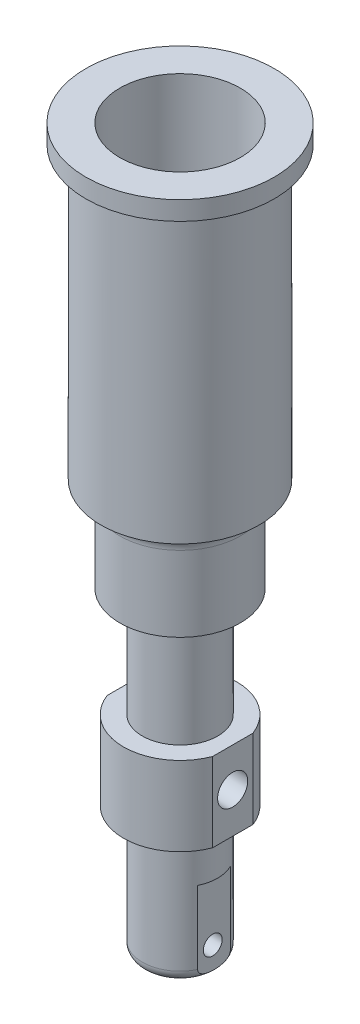
ISO-10303-21;
HEADER;
FILE_DESCRIPTION(('STEP AP214'),'2;1');
FILE_NAME('part.step','',(''),(''),'','','');
FILE_SCHEMA(('AUTOMOTIVE_DESIGN { 1 0 10303 214 1 1 1 1 }'));
ENDSEC;
DATA;
#1=APPLICATION_CONTEXT('core data for automotive mechanical design processes');
#2=APPLICATION_PROTOCOL_DEFINITION('international standard','automotive_design',2000,#1);
#3=PRODUCT_CONTEXT('',#1,'mechanical');
#4=PRODUCT('Part','Part','',(#3));
#5=PRODUCT_RELATED_PRODUCT_CATEGORY('part','',(#4));
#6=PRODUCT_DEFINITION_FORMATION('','',#4);
#7=PRODUCT_DEFINITION_CONTEXT('part definition',#1,'design');
#8=PRODUCT_DEFINITION('design','',#6,#7);
#9=PRODUCT_DEFINITION_SHAPE('','',#8);
#10=(LENGTH_UNIT() NAMED_UNIT(*) SI_UNIT(.MILLI.,.METRE.));
#11=(NAMED_UNIT(*) PLANE_ANGLE_UNIT() SI_UNIT($,.RADIAN.));
#12=(NAMED_UNIT(*) SI_UNIT($,.STERADIAN.) SOLID_ANGLE_UNIT());
#13=UNCERTAINTY_MEASURE_WITH_UNIT(LENGTH_MEASURE(1.E-05),#10,'distance_accuracy_value','');
#14=(GEOMETRIC_REPRESENTATION_CONTEXT(3) GLOBAL_UNCERTAINTY_ASSIGNED_CONTEXT((#13)) GLOBAL_UNIT_ASSIGNED_CONTEXT((#10,
#11,#12)) REPRESENTATION_CONTEXT('',''));
#15=CARTESIAN_POINT('',(0.,0.,0.));
#16=DIRECTION('',(0.,0.,1.));
#17=DIRECTION('',(1.,0.,0.));
#18=AXIS2_PLACEMENT_3D('',#15,#16,#17);
#19=CARTESIAN_POINT('',(0.,-82.,0.));
#20=DIRECTION('',(0.,1.,0.));
#21=DIRECTION('',(0.,0.,1.));
#22=AXIS2_PLACEMENT_3D('',#19,#20,#21);
#23=CYLINDRICAL_SURFACE('',#22,15.);
#24=CARTESIAN_POINT('',(0.,-82.,0.));
#25=DIRECTION('',(0.,-1.,0.));
#26=DIRECTION('',(0.,0.,-1.));
#27=AXIS2_PLACEMENT_3D('',#24,#25,#26);
#28=CIRCLE('',#27,15.);
#29=CARTESIAN_POINT('',(14.0111880375358,-82.,5.35598821664264));
#30=VERTEX_POINT('',#29);
#31=CARTESIAN_POINT('',(-14.0111880375358,-82.,5.35598821664264));
#32=VERTEX_POINT('',#31);
#33=EDGE_CURVE('E56',#30,#32,#28,.T.);
#34=ORIENTED_EDGE('',*,*,#33,.F.);
#35=DIRECTION('',(0.,1.,0.));
#36=VECTOR('',#35,1.);
#37=CARTESIAN_POINT('',(14.0111880375358,-82.,5.35598821664264));
#38=LINE('',#37,#36);
#39=CARTESIAN_POINT('',(14.0111880375358,-61.,5.35598821664264));
#40=VERTEX_POINT('',#39);
#41=EDGE_CURVE('E266',#30,#40,#38,.T.);
#42=ORIENTED_EDGE('',*,*,#41,.T.);
#43=CARTESIAN_POINT('',(0.,-61.,0.));
#44=DIRECTION('',(0.,-1.,0.));
#45=DIRECTION('',(0.,0.,-1.));
#46=AXIS2_PLACEMENT_3D('',#43,#44,#45);
#47=CIRCLE('',#46,15.);
#48=CARTESIAN_POINT('',(-14.0111880375358,-61.,5.35598821664264));
#49=VERTEX_POINT('',#48);
#50=EDGE_CURVE('E114',#40,#49,#47,.T.);
#51=ORIENTED_EDGE('',*,*,#50,.T.);
#52=DIRECTION('',(0.,1.,0.));
#53=VECTOR('',#52,1.);
#54=CARTESIAN_POINT('',(-14.0111880375358,-82.,5.35598821664264));
#55=LINE('',#54,#53);
#56=EDGE_CURVE('E265',#49,#32,#55,.F.);
#57=ORIENTED_EDGE('',*,*,#56,.T.);
#58=EDGE_LOOP('',(#34,#42,#51,#57));
#59=FACE_BOUND('',#58,.T.);
#60=ADVANCED_FACE('F32',(#59),#23,.T.);
#61=CARTESIAN_POINT('',(0.,-116.,0.));
#62=DIRECTION('',(0.,1.,0.));
#63=DIRECTION('',(0.,0.,1.));
#64=AXIS2_PLACEMENT_3D('',#61,#62,#63);
#65=CYLINDRICAL_SURFACE('',#64,10.);
#66=CARTESIAN_POINT('',(0.,-32.,0.));
#67=DIRECTION('',(0.,-1.,0.));
#68=DIRECTION('',(0.,0.,-1.));
#69=AXIS2_PLACEMENT_3D('',#66,#67,#68);
#70=CIRCLE('',#69,10.);
#71=CARTESIAN_POINT('',(0.,-32.,-10.));
#72=VERTEX_POINT('',#71);
#73=EDGE_CURVE('E137',#72,#72,#70,.T.);
#74=ORIENTED_EDGE('',*,*,#73,.T.);
#75=EDGE_LOOP('',(#74));
#76=FACE_BOUND('',#75,.T.);
#77=CARTESIAN_POINT('',(0.,-61.,0.));
#78=DIRECTION('',(0.,-1.,0.));
#79=DIRECTION('',(0.,0.,-1.));
#80=AXIS2_PLACEMENT_3D('',#77,#78,#79);
#81=CIRCLE('',#80,10.);
#82=CARTESIAN_POINT('',(0.,-61.,-10.));
#83=VERTEX_POINT('',#82);
#84=EDGE_CURVE('E11',#83,#83,#81,.T.);
#85=ORIENTED_EDGE('',*,*,#84,.F.);
#86=EDGE_LOOP('',(#85));
#87=FACE_BOUND('',#86,.T.);
#88=ADVANCED_FACE('F205',(#76,#87),#65,.T.);
#89=CARTESIAN_POINT('',(0.,70.,0.));
#90=DIRECTION('',(0.,-1.,0.));
#91=DIRECTION('',(0.,0.,-1.));
#92=AXIS2_PLACEMENT_3D('',#89,#90,#91);
#93=CYLINDRICAL_SURFACE('',#92,21.);
#94=CARTESIAN_POINT('',(0.,70.,0.));
#95=DIRECTION('',(0.,1.,0.));
#96=DIRECTION('',(0.,0.,1.));
#97=AXIS2_PLACEMENT_3D('',#94,#95,#96);
#98=CIRCLE('',#97,21.);
#99=CARTESIAN_POINT('',(0.,70.,21.));
#100=VERTEX_POINT('',#99);
#101=EDGE_CURVE('E166',#100,#100,#98,.T.);
#102=ORIENTED_EDGE('',*,*,#101,.F.);
#103=EDGE_LOOP('',(#102));
#104=FACE_BOUND('',#103,.T.);
#105=CARTESIAN_POINT('',(0.,-7.,0.));
#106=DIRECTION('',(0.,-1.,0.));
#107=DIRECTION('',(0.,0.,-1.));
#108=AXIS2_PLACEMENT_3D('',#105,#106,#107);
#109=CIRCLE('',#108,21.);
#110=CARTESIAN_POINT('',(0.,-7.,-21.));
#111=VERTEX_POINT('',#110);
#112=EDGE_CURVE('E160',#111,#111,#109,.T.);
#113=ORIENTED_EDGE('',*,*,#112,.F.);
#114=EDGE_LOOP('',(#113));
#115=FACE_BOUND('',#114,.T.);
#116=ADVANCED_FACE('F215',(#104,#115),#93,.T.);
#117=CARTESIAN_POINT('',(0.,-32.,0.));
#118=DIRECTION('',(0.,-1.,0.));
#119=DIRECTION('',(0.,0.,-1.));
#120=AXIS2_PLACEMENT_3D('',#117,#118,#119);
#121=PLANE('',#120);
#122=CARTESIAN_POINT('',(0.,-32.,0.));
#123=DIRECTION('',(0.,-1.,0.));
#124=DIRECTION('',(0.,0.,-1.));
#125=AXIS2_PLACEMENT_3D('',#122,#123,#124);
#126=CIRCLE('',#125,16.);
#127=CARTESIAN_POINT('',(0.,-32.,-16.));
#128=VERTEX_POINT('',#127);
#129=EDGE_CURVE('E132',#128,#128,#126,.T.);
#130=ORIENTED_EDGE('',*,*,#129,.T.);
#131=EDGE_LOOP('',(#130));
#132=FACE_BOUND('',#131,.T.);
#133=ORIENTED_EDGE('',*,*,#73,.F.);
#134=EDGE_LOOP('',(#133));
#135=FACE_BOUND('',#134,.T.);
#136=ADVANCED_FACE('F217',(#132,#135),#121,.T.);
#137=CARTESIAN_POINT('',(0.,-32.,0.));
#138=DIRECTION('',(0.,1.,0.));
#139=DIRECTION('',(0.,0.,1.));
#140=AXIS2_PLACEMENT_3D('',#137,#138,#139);
#141=CYLINDRICAL_SURFACE('',#140,16.);
#142=CARTESIAN_POINT('',(0.,-12.,0.));
#143=DIRECTION('',(0.,-1.,0.));
#144=DIRECTION('',(0.,0.,-1.));
#145=AXIS2_PLACEMENT_3D('',#142,#143,#144);
#146=CIRCLE('',#145,16.);
#147=CARTESIAN_POINT('',(0.,-12.,-16.));
#148=VERTEX_POINT('',#147);
#149=EDGE_CURVE('E41',#148,#148,#146,.T.);
#150=ORIENTED_EDGE('',*,*,#149,.T.);
#151=EDGE_LOOP('',(#150));
#152=FACE_BOUND('',#151,.T.);
#153=ORIENTED_EDGE('',*,*,#129,.F.);
#154=EDGE_LOOP('',(#153));
#155=FACE_BOUND('',#154,.T.);
#156=ADVANCED_FACE('F223',(#152,#155),#141,.T.);
#157=CARTESIAN_POINT('',(0.,-12.,0.));
#158=DIRECTION('',(0.,-1.,0.));
#159=DIRECTION('',(0.,0.,-1.));
#160=AXIS2_PLACEMENT_3D('',#157,#158,#159);
#161=TOROIDAL_SURFACE('',#160,21.,5.);
#162=ORIENTED_EDGE('',*,*,#112,.T.);
#163=EDGE_LOOP('',(#162));
#164=FACE_BOUND('',#163,.T.);
#165=ORIENTED_EDGE('',*,*,#149,.F.);
#166=EDGE_LOOP('',(#165));
#167=FACE_BOUND('',#166,.T.);
#168=ADVANCED_FACE('F34',(#164,#167),#161,.F.);
#169=CARTESIAN_POINT('',(0.,70.,0.));
#170=DIRECTION('',(0.,1.,0.));
#171=DIRECTION('',(0.,0.,1.));
#172=AXIS2_PLACEMENT_3D('',#169,#170,#171);
#173=PLANE('',#172);
#174=CARTESIAN_POINT('',(0.,70.,0.));
#175=DIRECTION('',(0.,1.,0.));
#176=DIRECTION('',(0.,0.,1.));
#177=AXIS2_PLACEMENT_3D('',#174,#175,#176);
#178=CIRCLE('',#177,25.);
#179=CARTESIAN_POINT('',(0.,70.,25.));
#180=VERTEX_POINT('',#179);
#181=EDGE_CURVE('E127',#180,#180,#178,.T.);
#182=ORIENTED_EDGE('',*,*,#181,.F.);
#183=EDGE_LOOP('',(#182));
#184=FACE_BOUND('',#183,.T.);
#185=ORIENTED_EDGE('',*,*,#101,.T.);
#186=EDGE_LOOP('',(#185));
#187=FACE_BOUND('',#186,.T.);
#188=ADVANCED_FACE('F357',(#184,#187),#173,.F.);
#189=CARTESIAN_POINT('',(0.,75.,0.));
#190=DIRECTION('',(0.,1.,0.));
#191=DIRECTION('',(0.,0.,1.));
#192=AXIS2_PLACEMENT_3D('',#189,#190,#191);
#193=PLANE('',#192);
#194=CARTESIAN_POINT('',(0.,75.,0.));
#195=DIRECTION('',(0.,1.,0.));
#196=DIRECTION('',(0.,0.,1.));
#197=AXIS2_PLACEMENT_3D('',#194,#195,#196);
#198=CIRCLE('',#197,25.);
#199=CARTESIAN_POINT('',(0.,75.,25.));
#200=VERTEX_POINT('',#199);
#201=EDGE_CURVE('E129',#200,#200,#198,.T.);
#202=ORIENTED_EDGE('',*,*,#201,.T.);
#203=EDGE_LOOP('',(#202));
#204=FACE_BOUND('',#203,.T.);
#205=CARTESIAN_POINT('',(0.,75.,0.));
#206=DIRECTION('',(0.,1.,0.));
#207=DIRECTION('',(0.,0.,1.));
#208=AXIS2_PLACEMENT_3D('',#205,#206,#207);
#209=CIRCLE('',#208,16.);
#210=CARTESIAN_POINT('',(0.,75.,16.));
#211=VERTEX_POINT('',#210);
#212=EDGE_CURVE('E124',#211,#211,#209,.T.);
#213=ORIENTED_EDGE('',*,*,#212,.F.);
#214=EDGE_LOOP('',(#213));
#215=FACE_BOUND('',#214,.T.);
#216=ADVANCED_FACE('F366',(#204,#215),#193,.T.);
#217=CARTESIAN_POINT('',(0.,75.,0.));
#218=DIRECTION('',(0.,-1.,0.));
#219=DIRECTION('',(0.,0.,-1.));
#220=AXIS2_PLACEMENT_3D('',#217,#218,#219);
#221=CYLINDRICAL_SURFACE('',#220,25.);
#222=ORIENTED_EDGE('',*,*,#201,.F.);
#223=EDGE_LOOP('',(#222));
#224=FACE_BOUND('',#223,.T.);
#225=ORIENTED_EDGE('',*,*,#181,.T.);
#226=EDGE_LOOP('',(#225));
#227=FACE_BOUND('',#226,.T.);
#228=ADVANCED_FACE('F210',(#224,#227),#221,.T.);
#229=CARTESIAN_POINT('',(0.,0.,0.));
#230=DIRECTION('',(0.,-1.,0.));
#231=DIRECTION('',(0.,0.,-1.));
#232=AXIS2_PLACEMENT_3D('',#229,#230,#231);
#233=PLANE('',#232);
#234=CARTESIAN_POINT('',(0.,0.,0.));
#235=DIRECTION('',(0.,1.,0.));
#236=DIRECTION('',(0.,0.,1.));
#237=AXIS2_PLACEMENT_3D('',#234,#235,#236);
#238=CIRCLE('',#237,16.);
#239=CARTESIAN_POINT('',(0.,0.,16.));
#240=VERTEX_POINT('',#239);
#241=EDGE_CURVE('E163',#240,#240,#238,.T.);
#242=ORIENTED_EDGE('',*,*,#241,.T.);
#243=EDGE_LOOP('',(#242));
#244=FACE_BOUND('',#243,.T.);
#245=ADVANCED_FACE('F206',(#244),#233,.F.);
#246=CARTESIAN_POINT('',(0.,70.,0.));
#247=DIRECTION('',(0.,-1.,0.));
#248=DIRECTION('',(0.,0.,-1.));
#249=AXIS2_PLACEMENT_3D('',#246,#247,#248);
#250=CYLINDRICAL_SURFACE('',#249,16.);
#251=ORIENTED_EDGE('',*,*,#241,.F.);
#252=EDGE_LOOP('',(#251));
#253=FACE_BOUND('',#252,.T.);
#254=ORIENTED_EDGE('',*,*,#212,.T.);
#255=EDGE_LOOP('',(#254));
#256=FACE_BOUND('',#255,.T.);
#257=ADVANCED_FACE('F209',(#253,#256),#250,.F.);
#258=CARTESIAN_POINT('',(0.,-82.,0.));
#259=DIRECTION('',(0.,-1.,0.));
#260=DIRECTION('',(0.,0.,-1.));
#261=AXIS2_PLACEMENT_3D('',#258,#259,#260);
#262=PLANE('',#261);
#263=DIRECTION('',(0.,0.,-1.));
#264=VECTOR('',#263,1.);
#265=CARTESIAN_POINT('',(14.0111880375358,-82.,0.));
#266=LINE('',#265,#264);
#267=CARTESIAN_POINT('',(14.0111880375358,-82.,-5.35598821664264));
#268=VERTEX_POINT('',#267);
#269=EDGE_CURVE('E49',#30,#268,#266,.T.);
#270=ORIENTED_EDGE('',*,*,#269,.F.);
#271=ORIENTED_EDGE('',*,*,#33,.T.);
#272=DIRECTION('',(0.,0.,1.));
#273=VECTOR('',#272,1.);
#274=CARTESIAN_POINT('',(-14.0111880375358,-82.,0.));
#275=LINE('',#274,#273);
#276=CARTESIAN_POINT('',(-14.0111880375358,-82.,-5.35598821664264));
#277=VERTEX_POINT('',#276);
#278=EDGE_CURVE('E491',#277,#32,#275,.T.);
#279=ORIENTED_EDGE('',*,*,#278,.F.);
#280=EDGE_CURVE('E120',#277,#268,#28,.T.);
#281=ORIENTED_EDGE('',*,*,#280,.T.);
#282=EDGE_LOOP('',(#270,#271,#279,#281));
#283=FACE_BOUND('',#282,.T.);
#284=CARTESIAN_POINT('',(0.,-82.,0.));
#285=DIRECTION('',(0.,-1.,0.));
#286=DIRECTION('',(0.,0.,-1.));
#287=AXIS2_PLACEMENT_3D('',#284,#285,#286);
#288=CIRCLE('',#287,10.);
#289=CARTESIAN_POINT('',(0.,-82.,-10.));
#290=VERTEX_POINT('',#289);
#291=EDGE_CURVE('E128',#290,#290,#288,.T.);
#292=ORIENTED_EDGE('',*,*,#291,.F.);
#293=EDGE_LOOP('',(#292));
#294=FACE_BOUND('',#293,.T.);
#295=ADVANCED_FACE('F213',(#283,#294),#262,.T.);
#296=CARTESIAN_POINT('',(0.,-61.,0.));
#297=DIRECTION('',(0.,-1.,0.));
#298=DIRECTION('',(0.,0.,-1.));
#299=AXIS2_PLACEMENT_3D('',#296,#297,#298);
#300=PLANE('',#299);
#301=ORIENTED_EDGE('',*,*,#50,.F.);
#302=DIRECTION('',(0.,0.,-1.));
#303=VECTOR('',#302,1.);
#304=CARTESIAN_POINT('',(14.0111880375358,-61.,0.));
#305=LINE('',#304,#303);
#306=CARTESIAN_POINT('',(14.0111880375358,-61.,-5.35598821664264));
#307=VERTEX_POINT('',#306);
#308=EDGE_CURVE('E100',#40,#307,#305,.T.);
#309=ORIENTED_EDGE('',*,*,#308,.T.);
#310=CARTESIAN_POINT('',(-14.0111880375358,-61.,-5.35598821664264));
#311=VERTEX_POINT('',#310);
#312=EDGE_CURVE('E113',#311,#307,#47,.T.);
#313=ORIENTED_EDGE('',*,*,#312,.F.);
#314=DIRECTION('',(0.,0.,1.));
#315=VECTOR('',#314,1.);
#316=CARTESIAN_POINT('',(-14.0111880375358,-61.,0.));
#317=LINE('',#316,#315);
#318=EDGE_CURVE('E268',#311,#49,#317,.T.);
#319=ORIENTED_EDGE('',*,*,#318,.T.);
#320=EDGE_LOOP('',(#301,#309,#313,#319));
#321=FACE_BOUND('',#320,.T.);
#322=ORIENTED_EDGE('',*,*,#84,.T.);
#323=EDGE_LOOP('',(#322));
#324=FACE_BOUND('',#323,.T.);
#325=ADVANCED_FACE('F110',(#321,#324),#300,.F.);
#326=ORIENTED_EDGE('',*,*,#312,.T.);
#327=DIRECTION('',(0.,1.,0.));
#328=VECTOR('',#327,1.);
#329=CARTESIAN_POINT('',(14.0111880375358,-82.,-5.35598821664264));
#330=LINE('',#329,#328);
#331=EDGE_CURVE('E97',#307,#268,#330,.F.);
#332=ORIENTED_EDGE('',*,*,#331,.T.);
#333=ORIENTED_EDGE('',*,*,#280,.F.);
#334=DIRECTION('',(0.,1.,0.));
#335=VECTOR('',#334,1.);
#336=CARTESIAN_POINT('',(-14.0111880375358,-82.,-5.35598821664264));
#337=LINE('',#336,#335);
#338=EDGE_CURVE('E118',#277,#311,#337,.T.);
#339=ORIENTED_EDGE('',*,*,#338,.T.);
#340=EDGE_LOOP('',(#326,#332,#333,#339));
#341=FACE_BOUND('',#340,.T.);
#342=ADVANCED_FACE('F117',(#341),#23,.T.);
#343=CARTESIAN_POINT('',(50.4278001375235,-109.358787083363,1.91056780676854));
#344=DIRECTION('',(-0.999283051783891,0.,-0.0378600372091007));
#345=DIRECTION('',(-0.0378600372091007,0.,0.999283051783891));
#346=AXIS2_PLACEMENT_3D('',#343,#344,#345);
#347=CYLINDRICAL_SURFACE('',#346,2.5);
#348=CARTESIAN_POINT('',(9.01437020577589,-109.358787083363,0.341528888942956));
#349=DIRECTION('',(-1.,0.,0.));
#350=DIRECTION('',(0.,0.,-1.));
#351=AXIS2_PLACEMENT_3D('',#348,#349,#350);
#352=ELLIPSE('',#351,2.5017936564991,2.5);
#353=CARTESIAN_POINT('',(9.01437020577589,-109.358787083362,-2.16026476755615));
#354=VERTEX_POINT('',#353);
#355=EDGE_CURVE('E142',#354,#354,#352,.T.);
#356=ORIENTED_EDGE('',*,*,#355,.F.);
#357=EDGE_LOOP('',(#356));
#358=FACE_BOUND('',#357,.T.);
#359=CARTESIAN_POINT('',(-9.01437020577589,-109.358787083363,-0.341529611444963));
#360=DIRECTION('',(1.,0.,0.));
#361=DIRECTION('',(0.,0.,-1.));
#362=AXIS2_PLACEMENT_3D('',#359,#360,#361);
#363=ELLIPSE('',#362,2.5017936564991,2.5);
#364=CARTESIAN_POINT('',(-9.01437020577589,-109.358787083362,-2.84332326794407));
#365=VERTEX_POINT('',#364);
#366=EDGE_CURVE('E138',#365,#365,#363,.T.);
#367=ORIENTED_EDGE('',*,*,#366,.F.);
#368=EDGE_LOOP('',(#367));
#369=FACE_BOUND('',#368,.T.);
#370=ADVANCED_FACE('F198',(#358,#369),#347,.F.);
#371=CARTESIAN_POINT('',(0.,-116.,0.));
#372=DIRECTION('',(0.,-1.,0.));
#373=DIRECTION('',(0.,0.,-1.));
#374=AXIS2_PLACEMENT_3D('',#371,#372,#373);
#375=PLANE('',#374);
#376=CARTESIAN_POINT('',(0.,-116.,0.));
#377=DIRECTION('',(0.,-1.,0.));
#378=DIRECTION('',(0.,0.,-1.));
#379=AXIS2_PLACEMENT_3D('',#376,#377,#378);
#380=CIRCLE('',#379,7.);
#381=CARTESIAN_POINT('',(0.,-116.,-7.));
#382=VERTEX_POINT('',#381);
#383=EDGE_CURVE('E169',#382,#382,#380,.T.);
#384=ORIENTED_EDGE('',*,*,#383,.T.);
#385=EDGE_LOOP('',(#384));
#386=FACE_BOUND('',#385,.T.);
#387=ADVANCED_FACE('F195',(#386),#375,.T.);
#388=CARTESIAN_POINT('',(-16.8478305015469,-93.6616792504499,-38.));
#389=DIRECTION('',(0.,1.,0.));
#390=DIRECTION('',(0.,0.,1.));
#391=AXIS2_PLACEMENT_3D('',#388,#389,#390);
#392=PLANE('',#391);
#393=DIRECTION('',(0.,0.,1.));
#394=VECTOR('',#393,1.);
#395=CARTESIAN_POINT('',(-9.01437020577589,-93.6616792504499,-38.));
#396=LINE('',#395,#394);
#397=CARTESIAN_POINT('',(-9.01437020577589,-93.6616792504499,-4.32910265450243));
#398=VERTEX_POINT('',#397);
#399=CARTESIAN_POINT('',(-9.01437020577589,-93.6616792504499,4.32910265450243));
#400=VERTEX_POINT('',#399);
#401=EDGE_CURVE('E151',#398,#400,#396,.T.);
#402=ORIENTED_EDGE('',*,*,#401,.T.);
#403=CARTESIAN_POINT('',(0.,-93.6616792504499,0.));
#404=DIRECTION('',(0.,1.,0.));
#405=DIRECTION('',(0.,0.,1.));
#406=AXIS2_PLACEMENT_3D('',#403,#404,#405);
#407=CIRCLE('',#406,10.);
#408=EDGE_CURVE('E181',#398,#400,#407,.T.);
#409=ORIENTED_EDGE('',*,*,#408,.F.);
#410=EDGE_LOOP('',(#402,#409));
#411=FACE_BOUND('',#410,.T.);
#412=ADVANCED_FACE('F192',(#411),#392,.F.);
#413=CARTESIAN_POINT('',(-9.01437020577589,-93.6616792504499,-38.));
#414=DIRECTION('',(1.,0.,0.));
#415=DIRECTION('',(0.,0.,-1.));
#416=AXIS2_PLACEMENT_3D('',#413,#414,#415);
#417=PLANE('',#416);
#418=ORIENTED_EDGE('',*,*,#366,.T.);
#419=EDGE_LOOP('',(#418));
#420=FACE_BOUND('',#419,.T.);
#421=CARTESIAN_POINT('',(-9.01437020577589,-115.223131276844,0.));
#422=CARTESIAN_POINT('',(-9.01437020577589,-115.223135742932,0.194954868494916));
#423=CARTESIAN_POINT('',(-9.01437020577589,-115.217437848396,0.389926479462349));
#424=CARTESIAN_POINT('',(-9.01437020577589,-115.194212735626,0.779267616668042));
#425=CARTESIAN_POINT('',(-9.01437020577589,-115.17667993859,0.973636815509763));
#426=CARTESIAN_POINT('',(-9.01437020577589,-115.128488680477,1.36024574318942));
#427=CARTESIAN_POINT('',(-9.01437020577589,-115.097865913496,1.55248981499963));
#428=CARTESIAN_POINT('',(-9.01437020577589,-115.021192648979,1.93378819701101));
#429=CARTESIAN_POINT('',(-9.01437020577589,-114.975157787172,2.12284553682891));
#430=CARTESIAN_POINT('',(-9.01437020577589,-114.875446255606,2.45740769855443));
#431=CARTESIAN_POINT('',(-9.01437020577589,-114.825240887567,2.60393376049608));
#432=CARTESIAN_POINT('',(-9.01437020577589,-114.710275408875,2.8915224921573));
#433=CARTESIAN_POINT('',(-9.01437020577589,-114.645496973707,3.03257801899886));
#434=CARTESIAN_POINT('',(-9.01437020577589,-114.497558010347,3.30703373696461));
#435=CARTESIAN_POINT('',(-9.01437020577589,-114.41419141262,3.44032513823527));
#436=CARTESIAN_POINT('',(-9.01437020577589,-114.226045684209,3.6908768823397));
#437=CARTESIAN_POINT('',(-9.01437020577589,-114.121347917377,3.80819539527714));
#438=CARTESIAN_POINT('',(-9.01437020577589,-113.938648904608,3.97130273377863));
#439=CARTESIAN_POINT('',(-9.01437020577589,-113.868692546851,4.0260798162863));
#440=CARTESIAN_POINT('',(-9.01437020577589,-113.721219141939,4.12444855912248));
#441=CARTESIAN_POINT('',(-9.01437020577589,-113.643705752985,4.16804559473682));
#442=CARTESIAN_POINT('',(-9.01437020577589,-113.481280468955,4.24144035276855));
#443=CARTESIAN_POINT('',(-9.01437020577589,-113.396298710544,4.2710865236471));
#444=CARTESIAN_POINT('',(-9.01437020577589,-113.222154467999,4.31303768653589));
#445=CARTESIAN_POINT('',(-9.01437020577589,-113.132997335336,4.32536428032007));
#446=CARTESIAN_POINT('',(-9.01437020577589,-112.966086037641,4.3309775012872));
#447=CARTESIAN_POINT('',(-9.01437020577589,-112.888403214648,4.32659217314209));
#448=CARTESIAN_POINT('',(-9.01437020577589,-112.735024990673,4.30425395952389));
#449=CARTESIAN_POINT('',(-9.01437020577589,-112.659329883199,4.2862990818807));
#450=CARTESIAN_POINT('',(-9.01437020577589,-112.514759689088,4.23914351918063));
#451=CARTESIAN_POINT('',(-9.01437020577589,-112.445735035479,4.21039273881975));
#452=CARTESIAN_POINT('',(-9.01437020577589,-112.312525458287,4.14337429322377));
#453=CARTESIAN_POINT('',(-9.01437020577589,-112.248342042172,4.10510367950834));
#454=CARTESIAN_POINT('',(-9.01437020577589,-112.091015765229,3.99728431589468));
#455=CARTESIAN_POINT('',(-9.01437020577589,-112.001673600973,3.92219194352925));
#456=CARTESIAN_POINT('',(-9.01437020577589,-111.835908594767,3.75884421860779));
#457=CARTESIAN_POINT('',(-9.01437020577589,-111.759522368558,3.67055284423467));
#458=CARTESIAN_POINT('',(-9.01437020577589,-111.632508054745,3.50328366571025));
#459=CARTESIAN_POINT('',(-9.01437020577589,-111.579766829129,3.42587824965997));
#460=CARTESIAN_POINT('',(-9.01437020577589,-111.481205778649,3.26675280106308));
#461=CARTESIAN_POINT('',(-9.01437020577589,-111.435390428991,3.18503002444893));
#462=CARTESIAN_POINT('',(-9.01437020577589,-111.307158408827,2.9349920120179));
#463=CARTESIAN_POINT('',(-9.01437020577589,-111.234026894145,2.7619064579578));
#464=CARTESIAN_POINT('',(-9.01437020577589,-111.110598070547,2.41746735463594));
#465=CARTESIAN_POINT('',(-9.01437020577589,-111.059372736217,2.24642990890531));
#466=CARTESIAN_POINT('',(-9.01437020577589,-110.971473682993,1.90053686447829));
#467=CARTESIAN_POINT('',(-9.01437020577589,-110.934813891749,1.72567777921674));
#468=CARTESIAN_POINT('',(-9.01437020577589,-110.873636634305,1.37317726245387));
#469=CARTESIAN_POINT('',(-9.01437020577589,-110.849168843758,1.19552744179763));
#470=CARTESIAN_POINT('',(-9.01437020577589,-110.811009718515,0.839058688630813));
#471=CARTESIAN_POINT('',(-9.01437020577589,-110.797321085196,0.660239474371104));
#472=CARTESIAN_POINT('',(-9.01437020577589,-110.776426082338,0.232952507611937));
#473=CARTESIAN_POINT('',(-9.01437020577589,-110.773765038707,-0.0157417029481948));
#474=CARTESIAN_POINT('',(-9.01437020577589,-110.787006858277,-0.512937057466037));
#475=CARTESIAN_POINT('',(-9.01437020577589,-110.802928807959,-0.761437740136252));
#476=CARTESIAN_POINT('',(-9.01437020577589,-110.842288359594,-1.13225991738398));
#477=CARTESIAN_POINT('',(-9.01437020577589,-110.85796504541,-1.25542771821745));
#478=CARTESIAN_POINT('',(-9.01437020577589,-110.894982572878,-1.50090107984475));
#479=CARTESIAN_POINT('',(-9.01437020577589,-110.916322341543,-1.62320679947578));
#480=CARTESIAN_POINT('',(-9.01437020577589,-110.965276376324,-1.86633789669504));
#481=CARTESIAN_POINT('',(-9.01437020577589,-110.992879213836,-1.98716555331898));
#482=CARTESIAN_POINT('',(-9.01437020577589,-111.05524320054,-2.22700577697688));
#483=CARTESIAN_POINT('',(-9.01437020577589,-111.090005494302,-2.34601805051706));
#484=CARTESIAN_POINT('',(-9.01437020577589,-111.164901234958,-2.5726969846673));
#485=CARTESIAN_POINT('',(-9.01437020577589,-111.20445181294,-2.6805544408843));
#486=CARTESIAN_POINT('',(-9.01437020577589,-111.291636591381,-2.89291108110999));
#487=CARTESIAN_POINT('',(-9.01437020577589,-111.339265342278,-2.9974124729763));
#488=CARTESIAN_POINT('',(-9.01437020577589,-111.443497688531,-3.20101726706308));
#489=CARTESIAN_POINT('',(-9.01437020577589,-111.500039189901,-3.30015207171137));
#490=CARTESIAN_POINT('',(-9.01437020577589,-111.623590012953,-3.49158343738469));
#491=CARTESIAN_POINT('',(-9.01437020577589,-111.69058256904,-3.58389060761713));
#492=CARTESIAN_POINT('',(-9.01437020577589,-111.82310699475,-3.7428301761613));
#493=CARTESIAN_POINT('',(-9.01437020577589,-111.886685041866,-3.81107759070752));
#494=CARTESIAN_POINT('',(-9.01437020577589,-112.022335480705,-3.93878774759733));
#495=CARTESIAN_POINT('',(-9.01437020577589,-112.094413674294,-3.99824442661192));
#496=CARTESIAN_POINT('',(-9.01437020577589,-112.247810359148,-4.10585916492267));
#497=CARTESIAN_POINT('',(-9.01437020577589,-112.329215305303,-4.15389627062577));
#498=CARTESIAN_POINT('',(-9.01437020577589,-112.499487566314,-4.23420853056648));
#499=CARTESIAN_POINT('',(-9.01437020577589,-112.588343515769,-4.26650719672046));
#500=CARTESIAN_POINT('',(-9.01437020577589,-112.764355709361,-4.31050535872244));
#501=CARTESIAN_POINT('',(-9.01437020577589,-112.85118052841,-4.32351068696158));
#502=CARTESIAN_POINT('',(-9.01437020577589,-113.025661734851,-4.3317741769706));
#503=CARTESIAN_POINT('',(-9.01437020577589,-113.113317616331,-4.32704252105693));
#504=CARTESIAN_POINT('',(-9.01437020577589,-113.27258976666,-4.30245976683733));
#505=CARTESIAN_POINT('',(-9.01437020577589,-113.344599826873,-4.28504543263452));
#506=CARTESIAN_POINT('',(-9.01437020577589,-113.484988386736,-4.23919733894239));
#507=CARTESIAN_POINT('',(-9.01437020577589,-113.553365898061,-4.21076059781695));
#508=CARTESIAN_POINT('',(-9.01437020577589,-113.708834647184,-4.1327402037085));
#509=CARTESIAN_POINT('',(-9.01437020577589,-113.793952538116,-4.07923315516189));
#510=CARTESIAN_POINT('',(-9.01437020577589,-113.95443873899,-3.95922066607282));
#511=CARTESIAN_POINT('',(-9.01437020577589,-114.029787434077,-3.89268972765362));
#512=CARTESIAN_POINT('',(-9.01437020577589,-114.206082039573,-3.71462095189032));
#513=CARTESIAN_POINT('',(-9.01437020577589,-114.301036015919,-3.59719225510854));
#514=CARTESIAN_POINT('',(-9.01437020577589,-114.472042502382,-3.34936427452676));
#515=CARTESIAN_POINT('',(-9.01437020577589,-114.548047906329,-3.21893377199876));
#516=CARTESIAN_POINT('',(-9.01437020577589,-114.676697869275,-2.96482605763924));
#517=CARTESIAN_POINT('',(-9.01437020577589,-114.73098590648,-2.84196291304962));
#518=CARTESIAN_POINT('',(-9.01437020577589,-114.828863842084,-2.59198991905079));
#519=CARTESIAN_POINT('',(-9.01437020577589,-114.872444710998,-2.46487658732557));
#520=CARTESIAN_POINT('',(-9.01437020577589,-114.950477548176,-2.20776291348854));
#521=CARTESIAN_POINT('',(-9.01437020577589,-114.984919094209,-2.07775945702234));
#522=CARTESIAN_POINT('',(-9.01437020577589,-115.045854905517,-1.81596811557592));
#523=CARTESIAN_POINT('',(-9.01437020577589,-115.072351497275,-1.68418076480187));
#524=CARTESIAN_POINT('',(-9.01437020577589,-115.117604908961,-1.4238432398666));
#525=CARTESIAN_POINT('',(-9.01437020577589,-115.136591107785,-1.29533236155991));
#526=CARTESIAN_POINT('',(-9.01437020577589,-115.168700373241,-1.0375640688758));
#527=CARTESIAN_POINT('',(-9.01437020577589,-115.181822333755,-0.908306518313682));
#528=CARTESIAN_POINT('',(-9.01437020577589,-115.202649104729,-0.64931190960013));
#529=CARTESIAN_POINT('',(-9.01437020577589,-115.210351912983,-0.519574692004701));
#530=CARTESIAN_POINT('',(-9.01437020577589,-115.220591686201,-0.259894138185768));
#531=CARTESIAN_POINT('',(-9.01437020577589,-115.22312829989,-0.129950788547529));
#532=CARTESIAN_POINT('',(-9.01437020577589,-115.223131276844,0.));
#533=B_SPLINE_CURVE_WITH_KNOTS('',3,(#421,#422,#423,#424,#425,#426,#427,#428,#429,#430,#431,
#432,#433,#434,#435,#436,#437,#438,#439,#440,#441,#442,#443,#444,#445,#446,#447,#448,#449,#450,
#451,#452,#453,#454,#455,#456,#457,#458,#459,#460,#461,#462,#463,#464,#465,#466,#467,#468,#469,
#470,#471,#472,#473,#474,#475,#476,#477,#478,#479,#480,#481,#482,#483,#484,#485,#486,#487,#488,
#489,#490,#491,#492,#493,#494,#495,#496,#497,#498,#499,#500,#501,#502,#503,#504,#505,#506,#507,
#508,#509,#510,#511,#512,#513,#514,#515,#516,#517,#518,#519,#520,#521,#522,#523,#524,#525,#526,
#527,#528,#529,#530,#531,#532),.UNSPECIFIED.,.T.,.F.,(4,2,2,2,2,2,2,2,2,2,2,2,2,2,2,2,2,2,2,2,2,
2,2,2,2,2,2,2,2,2,2,2,2,2,2,2,2,2,2,2,2,2,2,2,2,2,2,2,2,2,2,2,2,2,2,4),(0.,0.584807184234457,
1.16989023080832,1.75338793318911,2.33629545597973,2.8003651711112,3.26502171267462,
3.7351110598314,4.20343982215743,4.46916681983002,4.7347658173292,5.00318702312906,
5.27127314355658,5.50346935873059,5.73569966967442,5.95916718155035,6.18270399209146,
6.53084672838587,6.87995754940116,7.16055927422733,7.44134154394875,8.00326861263399,
8.53820617470393,9.07365402295709,9.61126604106224,10.1490127479901,10.8944438528733,
11.6406412598372,12.0130208218177,12.3853298791972,12.7569649486814,13.1286594770233,
13.4730240127682,13.8171571564012,14.1589908921026,14.5002817922091,14.7794487270991,
15.0588073254262,15.3410047022062,15.6227791971913,15.8844401230804,16.145950859614,
16.3672496197724,16.5886082845766,16.8885451491687,17.1890752045011,17.6395881997615,
18.0912102464176,18.4935944278449,18.896316788883,19.2994964487513,19.7025579319176,
20.0921281840247,20.481771886271,20.8715594741038,21.2613735645455),.UNSPECIFIED.);
#534=CARTESIAN_POINT('',(-9.01437020577589,-113.,-4.32910265450243));
#535=VERTEX_POINT('',#534);
#536=CARTESIAN_POINT('',(-9.01437020577589,-113.,4.32910265450243));
#537=VERTEX_POINT('',#536);
#538=EDGE_CURVE('E176',#535,#537,#533,.T.);
#539=ORIENTED_EDGE('',*,*,#538,.T.);
#540=DIRECTION('',(0.,1.,0.));
#541=VECTOR('',#540,1.);
#542=CARTESIAN_POINT('',(-9.01437020577589,-116.,4.32910265450243));
#543=LINE('',#542,#541);
#544=EDGE_CURVE('E154',#400,#537,#543,.F.);
#545=ORIENTED_EDGE('',*,*,#544,.F.);
#546=ORIENTED_EDGE('',*,*,#401,.F.);
#547=DIRECTION('',(0.,1.,0.));
#548=VECTOR('',#547,1.);
#549=CARTESIAN_POINT('',(-9.01437020577589,-116.,-4.32910265450243));
#550=LINE('',#549,#548);
#551=EDGE_CURVE('E157',#535,#398,#550,.T.);
#552=ORIENTED_EDGE('',*,*,#551,.F.);
#553=EDGE_LOOP('',(#539,#545,#546,#552));
#554=FACE_BOUND('',#553,.T.);
#555=ADVANCED_FACE('F186',(#420,#554),#417,.F.);
#556=CARTESIAN_POINT('',(16.8478305015469,-93.6616792504499,-38.));
#557=DIRECTION('',(0.,1.,0.));
#558=DIRECTION('',(0.,0.,1.));
#559=AXIS2_PLACEMENT_3D('',#556,#557,#558);
#560=PLANE('',#559);
#561=DIRECTION('',(0.,0.,1.));
#562=VECTOR('',#561,1.);
#563=CARTESIAN_POINT('',(9.01437020577589,-93.6616792504499,-38.));
#564=LINE('',#563,#562);
#565=CARTESIAN_POINT('',(9.01437020577589,-93.6616792504499,-4.32910265450243));
#566=VERTEX_POINT('',#565);
#567=CARTESIAN_POINT('',(9.01437020577589,-93.6616792504499,4.32910265450243));
#568=VERTEX_POINT('',#567);
#569=EDGE_CURVE('E141',#566,#568,#564,.T.);
#570=ORIENTED_EDGE('',*,*,#569,.F.);
#571=CARTESIAN_POINT('',(0.,-93.6616792504499,0.));
#572=DIRECTION('',(0.,1.,0.));
#573=DIRECTION('',(0.,0.,1.));
#574=AXIS2_PLACEMENT_3D('',#571,#572,#573);
#575=CIRCLE('',#574,10.);
#576=EDGE_CURVE('E276',#568,#566,#575,.T.);
#577=ORIENTED_EDGE('',*,*,#576,.F.);
#578=EDGE_LOOP('',(#570,#577));
#579=FACE_BOUND('',#578,.T.);
#580=ADVANCED_FACE('F191',(#579),#560,.F.);
#581=CARTESIAN_POINT('',(9.01437020577589,-93.6616792504499,-38.));
#582=DIRECTION('',(-1.,0.,0.));
#583=DIRECTION('',(0.,0.,1.));
#584=AXIS2_PLACEMENT_3D('',#581,#582,#583);
#585=PLANE('',#584);
#586=ORIENTED_EDGE('',*,*,#355,.T.);
#587=EDGE_LOOP('',(#586));
#588=FACE_BOUND('',#587,.T.);
#589=CARTESIAN_POINT('',(9.01437020577589,-115.223131276844,0.));
#590=CARTESIAN_POINT('',(9.01437020577589,-115.223135742932,-0.194954868494916));
#591=CARTESIAN_POINT('',(9.01437020577589,-115.217437848396,-0.389926479462349));
#592=CARTESIAN_POINT('',(9.01437020577589,-115.194212735626,-0.779267616668042));
#593=CARTESIAN_POINT('',(9.01437020577589,-115.17667993859,-0.973636815509763));
#594=CARTESIAN_POINT('',(9.01437020577589,-115.128488680477,-1.36024574318942));
#595=CARTESIAN_POINT('',(9.01437020577589,-115.097865913496,-1.55248981499963));
#596=CARTESIAN_POINT('',(9.01437020577589,-115.021192648979,-1.93378819701101));
#597=CARTESIAN_POINT('',(9.01437020577589,-114.975157787172,-2.12284553682891));
#598=CARTESIAN_POINT('',(9.01437020577589,-114.875446255606,-2.45740769855443));
#599=CARTESIAN_POINT('',(9.01437020577589,-114.825240887567,-2.60393376049608));
#600=CARTESIAN_POINT('',(9.01437020577589,-114.710275408875,-2.8915224921573));
#601=CARTESIAN_POINT('',(9.01437020577589,-114.645496973707,-3.03257801899886));
#602=CARTESIAN_POINT('',(9.01437020577589,-114.497558010347,-3.30703373696461));
#603=CARTESIAN_POINT('',(9.01437020577589,-114.41419141262,-3.44032513823527));
#604=CARTESIAN_POINT('',(9.01437020577589,-114.226045684209,-3.6908768823397));
#605=CARTESIAN_POINT('',(9.01437020577589,-114.121347917377,-3.80819539527714));
#606=CARTESIAN_POINT('',(9.01437020577589,-113.938648904608,-3.97130273377863));
#607=CARTESIAN_POINT('',(9.01437020577589,-113.868692546851,-4.0260798162863));
#608=CARTESIAN_POINT('',(9.01437020577589,-113.721219141939,-4.12444855912248));
#609=CARTESIAN_POINT('',(9.01437020577589,-113.643705752985,-4.16804559473682));
#610=CARTESIAN_POINT('',(9.01437020577589,-113.481280468955,-4.24144035276855));
#611=CARTESIAN_POINT('',(9.01437020577589,-113.396298710544,-4.2710865236471));
#612=CARTESIAN_POINT('',(9.01437020577589,-113.222154467999,-4.31303768653589));
#613=CARTESIAN_POINT('',(9.01437020577589,-113.132997335336,-4.32536428032007));
#614=CARTESIAN_POINT('',(9.01437020577589,-112.966086037641,-4.3309775012872));
#615=CARTESIAN_POINT('',(9.01437020577589,-112.888403214648,-4.32659217314209));
#616=CARTESIAN_POINT('',(9.01437020577589,-112.735024990673,-4.30425395952389));
#617=CARTESIAN_POINT('',(9.01437020577589,-112.659329883199,-4.2862990818807));
#618=CARTESIAN_POINT('',(9.01437020577589,-112.514759689088,-4.23914351918063));
#619=CARTESIAN_POINT('',(9.01437020577589,-112.445735035479,-4.21039273881975));
#620=CARTESIAN_POINT('',(9.01437020577589,-112.312525458287,-4.14337429322377));
#621=CARTESIAN_POINT('',(9.01437020577589,-112.248342042172,-4.10510367950834));
#622=CARTESIAN_POINT('',(9.01437020577589,-112.091015765229,-3.99728431589468));
#623=CARTESIAN_POINT('',(9.01437020577589,-112.001673600973,-3.92219194352925));
#624=CARTESIAN_POINT('',(9.01437020577589,-111.835908594767,-3.75884421860779));
#625=CARTESIAN_POINT('',(9.01437020577589,-111.759522368558,-3.67055284423467));
#626=CARTESIAN_POINT('',(9.01437020577589,-111.632508054745,-3.50328366571025));
#627=CARTESIAN_POINT('',(9.01437020577589,-111.579766829129,-3.42587824965997));
#628=CARTESIAN_POINT('',(9.01437020577589,-111.481205778649,-3.26675280106308));
#629=CARTESIAN_POINT('',(9.01437020577589,-111.435390428991,-3.18503002444893));
#630=CARTESIAN_POINT('',(9.01437020577589,-111.307158408827,-2.9349920120179));
#631=CARTESIAN_POINT('',(9.01437020577589,-111.234026894145,-2.7619064579578));
#632=CARTESIAN_POINT('',(9.01437020577589,-111.110598070547,-2.41746735463594));
#633=CARTESIAN_POINT('',(9.01437020577589,-111.059372736217,-2.24642990890531));
#634=CARTESIAN_POINT('',(9.01437020577589,-110.971473682993,-1.90053686447829));
#635=CARTESIAN_POINT('',(9.01437020577589,-110.934813891749,-1.72567777921674));
#636=CARTESIAN_POINT('',(9.01437020577589,-110.873636634305,-1.37317726245387));
#637=CARTESIAN_POINT('',(9.01437020577589,-110.849168843758,-1.19552744179763));
#638=CARTESIAN_POINT('',(9.01437020577589,-110.811009718515,-0.839058688630813));
#639=CARTESIAN_POINT('',(9.01437020577589,-110.797321085196,-0.660239474371104));
#640=CARTESIAN_POINT('',(9.01437020577589,-110.776426082338,-0.232952507611937));
#641=CARTESIAN_POINT('',(9.01437020577589,-110.773765038707,0.0157417029481948));
#642=CARTESIAN_POINT('',(9.01437020577589,-110.787006858277,0.512937057466037));
#643=CARTESIAN_POINT('',(9.01437020577589,-110.802928807959,0.761437740136252));
#644=CARTESIAN_POINT('',(9.01437020577589,-110.842288359594,1.13225991738398));
#645=CARTESIAN_POINT('',(9.01437020577589,-110.85796504541,1.25542771821745));
#646=CARTESIAN_POINT('',(9.01437020577589,-110.894982572878,1.50090107984475));
#647=CARTESIAN_POINT('',(9.01437020577589,-110.916322341543,1.62320679947578));
#648=CARTESIAN_POINT('',(9.01437020577589,-110.965276376324,1.86633789669504));
#649=CARTESIAN_POINT('',(9.01437020577589,-110.992879213836,1.98716555331898));
#650=CARTESIAN_POINT('',(9.01437020577589,-111.05524320054,2.22700577697688));
#651=CARTESIAN_POINT('',(9.01437020577589,-111.090005494302,2.34601805051706));
#652=CARTESIAN_POINT('',(9.01437020577589,-111.164901234958,2.5726969846673));
#653=CARTESIAN_POINT('',(9.01437020577589,-111.20445181294,2.6805544408843));
#654=CARTESIAN_POINT('',(9.01437020577589,-111.291636591381,2.89291108110999));
#655=CARTESIAN_POINT('',(9.01437020577589,-111.339265342278,2.9974124729763));
#656=CARTESIAN_POINT('',(9.01437020577589,-111.443497688531,3.20101726706308));
#657=CARTESIAN_POINT('',(9.01437020577589,-111.500039189901,3.30015207171137));
#658=CARTESIAN_POINT('',(9.01437020577589,-111.623590012953,3.49158343738469));
#659=CARTESIAN_POINT('',(9.01437020577589,-111.69058256904,3.58389060761713));
#660=CARTESIAN_POINT('',(9.01437020577589,-111.82310699475,3.7428301761613));
#661=CARTESIAN_POINT('',(9.01437020577589,-111.886685041866,3.81107759070752));
#662=CARTESIAN_POINT('',(9.01437020577589,-112.022335480705,3.93878774759733));
#663=CARTESIAN_POINT('',(9.01437020577589,-112.094413674294,3.99824442661192));
#664=CARTESIAN_POINT('',(9.01437020577589,-112.247810359148,4.10585916492267));
#665=CARTESIAN_POINT('',(9.01437020577589,-112.329215305303,4.15389627062577));
#666=CARTESIAN_POINT('',(9.01437020577589,-112.499487566314,4.23420853056648));
#667=CARTESIAN_POINT('',(9.01437020577589,-112.588343515769,4.26650719672046));
#668=CARTESIAN_POINT('',(9.01437020577589,-112.764355709361,4.31050535872244));
#669=CARTESIAN_POINT('',(9.01437020577589,-112.85118052841,4.32351068696158));
#670=CARTESIAN_POINT('',(9.01437020577589,-113.025661734851,4.3317741769706));
#671=CARTESIAN_POINT('',(9.01437020577589,-113.113317616331,4.32704252105693));
#672=CARTESIAN_POINT('',(9.01437020577589,-113.27258976666,4.30245976683733));
#673=CARTESIAN_POINT('',(9.01437020577589,-113.344599826873,4.28504543263452));
#674=CARTESIAN_POINT('',(9.01437020577589,-113.484988386736,4.23919733894239));
#675=CARTESIAN_POINT('',(9.01437020577589,-113.553365898061,4.21076059781695));
#676=CARTESIAN_POINT('',(9.01437020577589,-113.708834647184,4.1327402037085));
#677=CARTESIAN_POINT('',(9.01437020577589,-113.793952538116,4.07923315516189));
#678=CARTESIAN_POINT('',(9.01437020577589,-113.95443873899,3.95922066607282));
#679=CARTESIAN_POINT('',(9.01437020577589,-114.029787434077,3.89268972765362));
#680=CARTESIAN_POINT('',(9.01437020577589,-114.206082039573,3.71462095189032));
#681=CARTESIAN_POINT('',(9.01437020577589,-114.301036015919,3.59719225510854));
#682=CARTESIAN_POINT('',(9.01437020577589,-114.472042502382,3.34936427452676));
#683=CARTESIAN_POINT('',(9.01437020577589,-114.548047906329,3.21893377199876));
#684=CARTESIAN_POINT('',(9.01437020577589,-114.676697869275,2.96482605763924));
#685=CARTESIAN_POINT('',(9.01437020577589,-114.73098590648,2.84196291304962));
#686=CARTESIAN_POINT('',(9.01437020577589,-114.828863842084,2.59198991905079));
#687=CARTESIAN_POINT('',(9.01437020577589,-114.872444710998,2.46487658732557));
#688=CARTESIAN_POINT('',(9.01437020577589,-114.950477548176,2.20776291348854));
#689=CARTESIAN_POINT('',(9.01437020577589,-114.984919094209,2.07775945702234));
#690=CARTESIAN_POINT('',(9.01437020577589,-115.045854905517,1.81596811557592));
#691=CARTESIAN_POINT('',(9.01437020577589,-115.072351497275,1.68418076480187));
#692=CARTESIAN_POINT('',(9.01437020577589,-115.117604908961,1.4238432398666));
#693=CARTESIAN_POINT('',(9.01437020577589,-115.136591107785,1.29533236155991));
#694=CARTESIAN_POINT('',(9.01437020577589,-115.168700373241,1.0375640688758));
#695=CARTESIAN_POINT('',(9.01437020577589,-115.181822333755,0.908306518313682));
#696=CARTESIAN_POINT('',(9.01437020577589,-115.202649104729,0.64931190960013));
#697=CARTESIAN_POINT('',(9.01437020577589,-115.210351912983,0.519574692004701));
#698=CARTESIAN_POINT('',(9.01437020577589,-115.220591686201,0.259894138185768));
#699=CARTESIAN_POINT('',(9.01437020577589,-115.22312829989,0.129950788547529));
#700=CARTESIAN_POINT('',(9.01437020577589,-115.223131276844,0.));
#701=B_SPLINE_CURVE_WITH_KNOTS('',3,(#589,#590,#591,#592,#593,#594,#595,#596,#597,#598,#599,
#600,#601,#602,#603,#604,#605,#606,#607,#608,#609,#610,#611,#612,#613,#614,#615,#616,#617,#618,
#619,#620,#621,#622,#623,#624,#625,#626,#627,#628,#629,#630,#631,#632,#633,#634,#635,#636,#637,
#638,#639,#640,#641,#642,#643,#644,#645,#646,#647,#648,#649,#650,#651,#652,#653,#654,#655,#656,
#657,#658,#659,#660,#661,#662,#663,#664,#665,#666,#667,#668,#669,#670,#671,#672,#673,#674,#675,
#676,#677,#678,#679,#680,#681,#682,#683,#684,#685,#686,#687,#688,#689,#690,#691,#692,#693,#694,
#695,#696,#697,#698,#699,#700),.UNSPECIFIED.,.T.,.F.,(4,2,2,2,2,2,2,2,2,2,2,2,2,2,2,2,2,2,2,2,2,
2,2,2,2,2,2,2,2,2,2,2,2,2,2,2,2,2,2,2,2,2,2,2,2,2,2,2,2,2,2,2,2,2,2,4),(0.,0.584807184234457,
1.16989023080832,1.75338793318911,2.33629545597973,2.8003651711112,3.26502171267462,
3.7351110598314,4.20343982215743,4.46916681983002,4.7347658173292,5.00318702312906,
5.27127314355658,5.50346935873059,5.73569966967442,5.95916718155035,6.18270399209146,
6.53084672838587,6.87995754940116,7.16055927422733,7.44134154394875,8.00326861263399,
8.53820617470393,9.07365402295709,9.61126604106224,10.1490127479901,10.8944438528733,
11.6406412598372,12.0130208218177,12.3853298791972,12.7569649486814,13.1286594770233,
13.4730240127682,13.8171571564012,14.1589908921026,14.5002817922091,14.7794487270991,
15.0588073254262,15.3410047022062,15.6227791971913,15.8844401230804,16.145950859614,
16.3672496197724,16.5886082845766,16.8885451491687,17.1890752045011,17.6395881997615,
18.0912102464176,18.4935944278449,18.896316788883,19.2994964487513,19.7025579319176,
20.0921281840247,20.481771886271,20.8715594741038,21.2613735645455),.UNSPECIFIED.);
#702=CARTESIAN_POINT('',(9.01437020577589,-113.,4.32910265450243));
#703=VERTEX_POINT('',#702);
#704=CARTESIAN_POINT('',(9.01437020577589,-113.,-4.32910265450243));
#705=VERTEX_POINT('',#704);
#706=EDGE_CURVE('E282',#703,#705,#701,.T.);
#707=ORIENTED_EDGE('',*,*,#706,.T.);
#708=DIRECTION('',(0.,1.,0.));
#709=VECTOR('',#708,1.);
#710=CARTESIAN_POINT('',(9.01437020577589,-116.,-4.32910265450243));
#711=LINE('',#710,#709);
#712=EDGE_CURVE('E145',#566,#705,#711,.F.);
#713=ORIENTED_EDGE('',*,*,#712,.F.);
#714=ORIENTED_EDGE('',*,*,#569,.T.);
#715=DIRECTION('',(0.,1.,0.));
#716=VECTOR('',#715,1.);
#717=CARTESIAN_POINT('',(9.01437020577589,-116.,4.32910265450243));
#718=LINE('',#717,#716);
#719=EDGE_CURVE('E148',#703,#568,#718,.T.);
#720=ORIENTED_EDGE('',*,*,#719,.F.);
#721=EDGE_LOOP('',(#707,#713,#714,#720));
#722=FACE_BOUND('',#721,.T.);
#723=ADVANCED_FACE('F286',(#588,#722),#585,.F.);
#724=CARTESIAN_POINT('',(0.,-113.,0.));
#725=DIRECTION('',(0.,-1.,0.));
#726=DIRECTION('',(0.,0.,-1.));
#727=AXIS2_PLACEMENT_3D('',#724,#725,#726);
#728=TOROIDAL_SURFACE('',#727,7.,3.);
#729=ORIENTED_EDGE('',*,*,#706,.F.);
#730=CARTESIAN_POINT('',(0.,-113.,0.));
#731=DIRECTION('',(0.,-1.,0.));
#732=DIRECTION('',(0.,0.,-1.));
#733=AXIS2_PLACEMENT_3D('',#730,#731,#732);
#734=CIRCLE('',#733,10.);
#735=EDGE_CURVE('E173',#537,#703,#734,.F.);
#736=ORIENTED_EDGE('',*,*,#735,.F.);
#737=ORIENTED_EDGE('',*,*,#538,.F.);
#738=EDGE_CURVE('E172',#705,#535,#734,.F.);
#739=ORIENTED_EDGE('',*,*,#738,.F.);
#740=EDGE_LOOP('',(#729,#736,#737,#739));
#741=FACE_BOUND('',#740,.T.);
#742=ORIENTED_EDGE('',*,*,#383,.F.);
#743=EDGE_LOOP('',(#742));
#744=FACE_BOUND('',#743,.T.);
#745=ADVANCED_FACE('F183',(#741,#744),#728,.T.);
#746=ORIENTED_EDGE('',*,*,#291,.T.);
#747=EDGE_LOOP('',(#746));
#748=FACE_BOUND('',#747,.T.);
#749=ORIENTED_EDGE('',*,*,#735,.T.);
#750=ORIENTED_EDGE('',*,*,#719,.T.);
#751=ORIENTED_EDGE('',*,*,#576,.T.);
#752=ORIENTED_EDGE('',*,*,#712,.T.);
#753=ORIENTED_EDGE('',*,*,#738,.T.);
#754=ORIENTED_EDGE('',*,*,#551,.T.);
#755=ORIENTED_EDGE('',*,*,#408,.T.);
#756=ORIENTED_EDGE('',*,*,#544,.T.);
#757=EDGE_LOOP('',(#749,#750,#751,#752,#753,#754,#755,#756));
#758=FACE_BOUND('',#757,.T.);
#759=ADVANCED_FACE('F200',(#748,#758),#65,.T.);
#760=CARTESIAN_POINT('',(50.9869003284961,-71.2986653096381,1.44331951310802));
#761=DIRECTION('',(-0.999283051783891,0.,-0.0378600372091007));
#762=DIRECTION('',(-0.0378600372091007,0.,0.999283051783891));
#763=AXIS2_PLACEMENT_3D('',#760,#761,#762);
#764=CYLINDRICAL_SURFACE('',#763,4.00000000192302);
#765=CARTESIAN_POINT('',(14.0111880375358,-71.2986653096381,0.0424132927236195));
#766=DIRECTION('',(-1.,0.,0.));
#767=DIRECTION('',(0.,0.,-1.));
#768=AXIS2_PLACEMENT_3D('',#765,#766,#767);
#769=ELLIPSE('',#768,4.00286985232296,4.00000000192302);
#770=CARTESIAN_POINT('',(14.0111880375358,-71.298665309638,-3.96045655959934));
#771=VERTEX_POINT('',#770);
#772=EDGE_CURVE('E36',#771,#771,#769,.F.);
#773=ORIENTED_EDGE('',*,*,#772,.T.);
#774=EDGE_LOOP('',(#773));
#775=FACE_BOUND('',#774,.T.);
#776=CARTESIAN_POINT('',(-14.0111880375358,-71.298665309638,-1.01927608447104));
#777=DIRECTION('',(1.,0.,0.));
#778=DIRECTION('',(0.,0.,-1.));
#779=AXIS2_PLACEMENT_3D('',#776,#777,#778);
#780=ELLIPSE('',#779,4.00286985232296,4.00000000192302);
#781=CARTESIAN_POINT('',(-14.0111880375358,-71.298665309638,-5.02214593679401));
#782=VERTEX_POINT('',#781);
#783=EDGE_CURVE('E264',#782,#782,#780,.F.);
#784=ORIENTED_EDGE('',*,*,#783,.T.);
#785=EDGE_LOOP('',(#784));
#786=FACE_BOUND('',#785,.T.);
#787=ADVANCED_FACE('F203',(#775,#786),#764,.F.);
#788=CARTESIAN_POINT('',(-14.0111880375358,-55.1125231910636,-25.5));
#789=DIRECTION('',(1.,0.,0.));
#790=DIRECTION('',(0.,0.,-1.));
#791=AXIS2_PLACEMENT_3D('',#788,#789,#790);
#792=PLANE('',#791);
#793=ORIENTED_EDGE('',*,*,#783,.F.);
#794=EDGE_LOOP('',(#793));
#795=FACE_BOUND('',#794,.T.);
#796=ORIENTED_EDGE('',*,*,#278,.T.);
#797=ORIENTED_EDGE('',*,*,#56,.F.);
#798=ORIENTED_EDGE('',*,*,#318,.F.);
#799=ORIENTED_EDGE('',*,*,#338,.F.);
#800=EDGE_LOOP('',(#796,#797,#798,#799));
#801=FACE_BOUND('',#800,.T.);
#802=ADVANCED_FACE('F250',(#795,#801),#792,.F.);
#803=CARTESIAN_POINT('',(14.0111880375358,-55.1125231910636,-25.5));
#804=DIRECTION('',(-1.,0.,0.));
#805=DIRECTION('',(0.,0.,1.));
#806=AXIS2_PLACEMENT_3D('',#803,#804,#805);
#807=PLANE('',#806);
#808=ORIENTED_EDGE('',*,*,#772,.F.);
#809=EDGE_LOOP('',(#808));
#810=FACE_BOUND('',#809,.T.);
#811=ORIENTED_EDGE('',*,*,#269,.T.);
#812=ORIENTED_EDGE('',*,*,#331,.F.);
#813=ORIENTED_EDGE('',*,*,#308,.F.);
#814=ORIENTED_EDGE('',*,*,#41,.F.);
#815=EDGE_LOOP('',(#811,#812,#813,#814));
#816=FACE_BOUND('',#815,.T.);
#817=ADVANCED_FACE('F99',(#810,#816),#807,.F.);
#818=CLOSED_SHELL('',(#60,#88,#116,#136,#156,#168,#188,#216,#228,#245,#257,#295,#325,#342,#370,
#387,#412,#555,#580,#723,#745,#759,#787,#802,#817));
#819=MANIFOLD_SOLID_BREP('B2',#818);
#820=ADVANCED_BREP_SHAPE_REPRESENTATION('',(#18,#819),#14);
#821=SHAPE_DEFINITION_REPRESENTATION(#9,#820);
ENDSEC;
END-ISO-10303-21;
